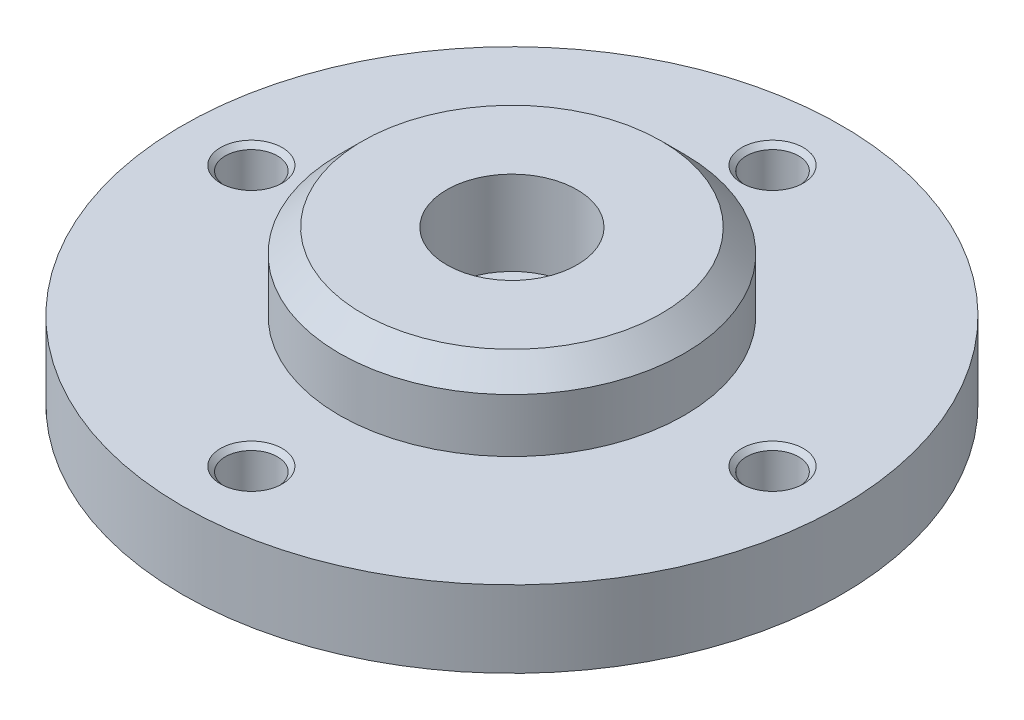
ISO-10303-21;
HEADER;
FILE_DESCRIPTION(('STEP AP214'),'2;1');
FILE_NAME('part.step','',(''),(''),'','','');
FILE_SCHEMA(('AUTOMOTIVE_DESIGN { 1 0 10303 214 1 1 1 1 }'));
ENDSEC;
DATA;
#1=APPLICATION_CONTEXT('core data for automotive mechanical design processes');
#2=APPLICATION_PROTOCOL_DEFINITION('international standard','automotive_design',2000,#1);
#3=PRODUCT_CONTEXT('',#1,'mechanical');
#4=PRODUCT('Part','Part','',(#3));
#5=PRODUCT_RELATED_PRODUCT_CATEGORY('part','',(#4));
#6=PRODUCT_DEFINITION_FORMATION('','',#4);
#7=PRODUCT_DEFINITION_CONTEXT('part definition',#1,'design');
#8=PRODUCT_DEFINITION('design','',#6,#7);
#9=PRODUCT_DEFINITION_SHAPE('','',#8);
#10=(LENGTH_UNIT() NAMED_UNIT(*) SI_UNIT(.MILLI.,.METRE.));
#11=(NAMED_UNIT(*) PLANE_ANGLE_UNIT() SI_UNIT($,.RADIAN.));
#12=(NAMED_UNIT(*) SI_UNIT($,.STERADIAN.) SOLID_ANGLE_UNIT());
#13=UNCERTAINTY_MEASURE_WITH_UNIT(LENGTH_MEASURE(1.E-05),#10,'distance_accuracy_value','');
#14=(GEOMETRIC_REPRESENTATION_CONTEXT(3) GLOBAL_UNCERTAINTY_ASSIGNED_CONTEXT((#13)) GLOBAL_UNIT_ASSIGNED_CONTEXT((#10,
#11,#12)) REPRESENTATION_CONTEXT('',''));
#15=CARTESIAN_POINT('',(0.,0.,0.));
#16=DIRECTION('',(0.,0.,1.));
#17=DIRECTION('',(1.,0.,0.));
#18=AXIS2_PLACEMENT_3D('',#15,#16,#17);
#19=CARTESIAN_POINT('',(43.,10.,0.));
#20=DIRECTION('',(0.,-1.,0.));
#21=DIRECTION('',(0.,0.,-1.));
#22=AXIS2_PLACEMENT_3D('',#19,#20,#21);
#23=PLANE('',#22);
#24=CARTESIAN_POINT('',(0.,10.,-34.));
#25=DIRECTION('',(0.,1.,0.));
#26=DIRECTION('',(0.,0.,1.));
#27=AXIS2_PLACEMENT_3D('',#24,#25,#26);
#28=CIRCLE('',#27,4.025);
#29=CARTESIAN_POINT('',(0.,10.,-29.975));
#30=VERTEX_POINT('',#29);
#31=EDGE_CURVE('E218',#30,#30,#28,.T.);
#32=ORIENTED_EDGE('',*,*,#31,.F.);
#33=EDGE_LOOP('',(#32));
#34=FACE_BOUND('',#33,.T.);
#35=CARTESIAN_POINT('',(34.,10.,0.));
#36=DIRECTION('',(0.,1.,0.));
#37=DIRECTION('',(0.,0.,1.));
#38=AXIS2_PLACEMENT_3D('',#35,#36,#37);
#39=CIRCLE('',#38,4.025);
#40=CARTESIAN_POINT('',(34.,10.,4.025));
#41=VERTEX_POINT('',#40);
#42=EDGE_CURVE('E72',#41,#41,#39,.T.);
#43=ORIENTED_EDGE('',*,*,#42,.F.);
#44=EDGE_LOOP('',(#43));
#45=FACE_BOUND('',#44,.T.);
#46=CARTESIAN_POINT('',(0.,10.,34.));
#47=DIRECTION('',(0.,1.,0.));
#48=DIRECTION('',(0.,0.,1.));
#49=AXIS2_PLACEMENT_3D('',#46,#47,#48);
#50=CIRCLE('',#49,4.025);
#51=CARTESIAN_POINT('',(0.,10.,38.025));
#52=VERTEX_POINT('',#51);
#53=EDGE_CURVE('E65',#52,#52,#50,.T.);
#54=ORIENTED_EDGE('',*,*,#53,.F.);
#55=EDGE_LOOP('',(#54));
#56=FACE_BOUND('',#55,.T.);
#57=CARTESIAN_POINT('',(0.,10.,0.));
#58=DIRECTION('',(0.,1.,0.));
#59=DIRECTION('',(0.,0.,1.));
#60=AXIS2_PLACEMENT_3D('',#57,#58,#59);
#61=CIRCLE('',#60,43.);
#62=CARTESIAN_POINT('',(0.,10.,43.));
#63=VERTEX_POINT('',#62);
#64=EDGE_CURVE('E106',#63,#63,#61,.T.);
#65=ORIENTED_EDGE('',*,*,#64,.T.);
#66=EDGE_LOOP('',(#65));
#67=FACE_BOUND('',#66,.T.);
#68=CARTESIAN_POINT('',(0.,10.,0.));
#69=DIRECTION('',(0.,1.,0.));
#70=DIRECTION('',(0.,0.,1.));
#71=AXIS2_PLACEMENT_3D('',#68,#69,#70);
#72=CIRCLE('',#71,22.5);
#73=CARTESIAN_POINT('',(0.,10.,22.5));
#74=VERTEX_POINT('',#73);
#75=EDGE_CURVE('E103',#74,#74,#72,.T.);
#76=ORIENTED_EDGE('',*,*,#75,.F.);
#77=EDGE_LOOP('',(#76));
#78=FACE_BOUND('',#77,.T.);
#79=CARTESIAN_POINT('',(-34.,10.,0.));
#80=DIRECTION('',(0.,1.,0.));
#81=DIRECTION('',(0.,0.,1.));
#82=AXIS2_PLACEMENT_3D('',#79,#80,#81);
#83=CIRCLE('',#82,4.025);
#84=CARTESIAN_POINT('',(-34.,10.,4.025));
#85=VERTEX_POINT('',#84);
#86=EDGE_CURVE('E61',#85,#85,#83,.T.);
#87=ORIENTED_EDGE('',*,*,#86,.F.);
#88=EDGE_LOOP('',(#87));
#89=FACE_BOUND('',#88,.T.);
#90=ADVANCED_FACE('F36',(#34,#45,#56,#67,#78,#89),#23,.F.);
#91=CARTESIAN_POINT('',(25.,0.,0.));
#92=DIRECTION('',(0.,1.,0.));
#93=DIRECTION('',(0.,0.,1.));
#94=AXIS2_PLACEMENT_3D('',#91,#92,#93);
#95=PLANE('',#94);
#96=CARTESIAN_POINT('',(0.,0.,-34.));
#97=DIRECTION('',(0.,1.,0.));
#98=DIRECTION('',(0.,0.,1.));
#99=AXIS2_PLACEMENT_3D('',#96,#97,#98);
#100=CIRCLE('',#99,3.39999999999999);
#101=CARTESIAN_POINT('',(0.,0.,-30.6));
#102=VERTEX_POINT('',#101);
#103=EDGE_CURVE('E41',#102,#102,#100,.T.);
#104=ORIENTED_EDGE('',*,*,#103,.T.);
#105=EDGE_LOOP('',(#104));
#106=FACE_BOUND('',#105,.T.);
#107=CARTESIAN_POINT('',(34.,0.,0.));
#108=DIRECTION('',(0.,1.,0.));
#109=DIRECTION('',(0.,0.,1.));
#110=AXIS2_PLACEMENT_3D('',#107,#108,#109);
#111=CIRCLE('',#110,3.39999999999999);
#112=CARTESIAN_POINT('',(34.,0.,3.39999999999999));
#113=VERTEX_POINT('',#112);
#114=EDGE_CURVE('E63',#113,#113,#111,.T.);
#115=ORIENTED_EDGE('',*,*,#114,.T.);
#116=EDGE_LOOP('',(#115));
#117=FACE_BOUND('',#116,.T.);
#118=CARTESIAN_POINT('',(0.,0.,34.));
#119=DIRECTION('',(0.,1.,0.));
#120=DIRECTION('',(0.,0.,1.));
#121=AXIS2_PLACEMENT_3D('',#118,#119,#120);
#122=CIRCLE('',#121,3.39999999999999);
#123=CARTESIAN_POINT('',(0.,0.,37.4));
#124=VERTEX_POINT('',#123);
#125=EDGE_CURVE('E59',#124,#124,#122,.T.);
#126=ORIENTED_EDGE('',*,*,#125,.T.);
#127=EDGE_LOOP('',(#126));
#128=FACE_BOUND('',#127,.T.);
#129=CARTESIAN_POINT('',(-34.,0.,0.));
#130=DIRECTION('',(0.,1.,0.));
#131=DIRECTION('',(0.,0.,1.));
#132=AXIS2_PLACEMENT_3D('',#129,#130,#131);
#133=CIRCLE('',#132,3.39999999999999);
#134=CARTESIAN_POINT('',(-34.,0.,3.4));
#135=VERTEX_POINT('',#134);
#136=EDGE_CURVE('E54',#135,#135,#133,.T.);
#137=ORIENTED_EDGE('',*,*,#136,.T.);
#138=EDGE_LOOP('',(#137));
#139=FACE_BOUND('',#138,.T.);
#140=CARTESIAN_POINT('',(0.,0.,0.));
#141=DIRECTION('',(0.,1.,0.));
#142=DIRECTION('',(0.,0.,1.));
#143=AXIS2_PLACEMENT_3D('',#140,#141,#142);
#144=CIRCLE('',#143,43.);
#145=CARTESIAN_POINT('',(0.,0.,43.));
#146=VERTEX_POINT('',#145);
#147=EDGE_CURVE('E50',#146,#146,#144,.T.);
#148=ORIENTED_EDGE('',*,*,#147,.F.);
#149=EDGE_LOOP('',(#148));
#150=FACE_BOUND('',#149,.T.);
#151=CARTESIAN_POINT('',(0.,0.,0.));
#152=DIRECTION('',(0.,1.,0.));
#153=DIRECTION('',(0.,0.,1.));
#154=AXIS2_PLACEMENT_3D('',#151,#152,#153);
#155=CIRCLE('',#154,25.);
#156=CARTESIAN_POINT('',(0.,0.,25.));
#157=VERTEX_POINT('',#156);
#158=EDGE_CURVE('E57',#157,#157,#155,.T.);
#159=ORIENTED_EDGE('',*,*,#158,.T.);
#160=EDGE_LOOP('',(#159));
#161=FACE_BOUND('',#160,.T.);
#162=ADVANCED_FACE('F113',(#106,#117,#128,#139,#150,#161),#95,.F.);
#163=CARTESIAN_POINT('',(0.,0.,0.));
#164=DIRECTION('',(0.,1.,0.));
#165=DIRECTION('',(0.,0.,1.));
#166=AXIS2_PLACEMENT_3D('',#163,#164,#165);
#167=CYLINDRICAL_SURFACE('',#166,43.);
#168=ORIENTED_EDGE('',*,*,#64,.F.);
#169=EDGE_LOOP('',(#168));
#170=FACE_BOUND('',#169,.T.);
#171=ORIENTED_EDGE('',*,*,#147,.T.);
#172=EDGE_LOOP('',(#171));
#173=FACE_BOUND('',#172,.T.);
#174=ADVANCED_FACE('F111',(#170,#173),#167,.T.);
#175=CARTESIAN_POINT('',(0.,0.,0.));
#176=DIRECTION('',(0.,1.,0.));
#177=DIRECTION('',(0.,0.,1.));
#178=AXIS2_PLACEMENT_3D('',#175,#176,#177);
#179=CYLINDRICAL_SURFACE('',#178,22.5);
#180=CARTESIAN_POINT('',(0.,17.,0.));
#181=DIRECTION('',(0.,-1.,0.));
#182=DIRECTION('',(0.,0.,-1.));
#183=AXIS2_PLACEMENT_3D('',#180,#181,#182);
#184=CIRCLE('',#183,22.5);
#185=CARTESIAN_POINT('',(0.,17.,-22.5));
#186=VERTEX_POINT('',#185);
#187=EDGE_CURVE('E10',#186,#186,#184,.T.);
#188=ORIENTED_EDGE('',*,*,#187,.T.);
#189=EDGE_LOOP('',(#188));
#190=FACE_BOUND('',#189,.T.);
#191=ORIENTED_EDGE('',*,*,#75,.T.);
#192=EDGE_LOOP('',(#191));
#193=FACE_BOUND('',#192,.T.);
#194=ADVANCED_FACE('F151',(#190,#193),#179,.T.);
#195=CARTESIAN_POINT('',(22.5,20.,0.));
#196=DIRECTION('',(0.,-1.,0.));
#197=DIRECTION('',(0.,0.,-1.));
#198=AXIS2_PLACEMENT_3D('',#195,#196,#197);
#199=PLANE('',#198);
#200=CARTESIAN_POINT('',(0.,20.,0.));
#201=DIRECTION('',(0.,-1.,0.));
#202=DIRECTION('',(0.,0.,-1.));
#203=AXIS2_PLACEMENT_3D('',#200,#201,#202);
#204=CIRCLE('',#203,19.5);
#205=CARTESIAN_POINT('',(0.,20.,-19.5));
#206=VERTEX_POINT('',#205);
#207=EDGE_CURVE('E45',#206,#206,#204,.F.);
#208=ORIENTED_EDGE('',*,*,#207,.T.);
#209=EDGE_LOOP('',(#208));
#210=FACE_BOUND('',#209,.T.);
#211=CARTESIAN_POINT('',(0.,20.,0.));
#212=DIRECTION('',(0.,1.,0.));
#213=DIRECTION('',(0.,0.,1.));
#214=AXIS2_PLACEMENT_3D('',#211,#212,#213);
#215=CIRCLE('',#214,8.5);
#216=CARTESIAN_POINT('',(0.,20.,8.5));
#217=VERTEX_POINT('',#216);
#218=EDGE_CURVE('E100',#217,#217,#215,.T.);
#219=ORIENTED_EDGE('',*,*,#218,.F.);
#220=EDGE_LOOP('',(#219));
#221=FACE_BOUND('',#220,.T.);
#222=ADVANCED_FACE('F146',(#210,#221),#199,.F.);
#223=CARTESIAN_POINT('',(0.,0.,0.));
#224=DIRECTION('',(0.,1.,0.));
#225=DIRECTION('',(0.,0.,1.));
#226=AXIS2_PLACEMENT_3D('',#223,#224,#225);
#227=CYLINDRICAL_SURFACE('',#226,8.5);
#228=CARTESIAN_POINT('',(0.,9.,0.));
#229=DIRECTION('',(0.,1.,0.));
#230=DIRECTION('',(0.,0.,1.));
#231=AXIS2_PLACEMENT_3D('',#228,#229,#230);
#232=CIRCLE('',#231,8.5);
#233=CARTESIAN_POINT('',(0.,9.,8.5));
#234=VERTEX_POINT('',#233);
#235=EDGE_CURVE('E97',#234,#234,#232,.T.);
#236=ORIENTED_EDGE('',*,*,#235,.F.);
#237=EDGE_LOOP('',(#236));
#238=FACE_BOUND('',#237,.T.);
#239=ORIENTED_EDGE('',*,*,#218,.T.);
#240=EDGE_LOOP('',(#239));
#241=FACE_BOUND('',#240,.T.);
#242=ADVANCED_FACE('F140',(#238,#241),#227,.F.);
#243=CARTESIAN_POINT('',(8.5,9.,0.));
#244=DIRECTION('',(0.,-1.,0.));
#245=DIRECTION('',(0.,0.,-1.));
#246=AXIS2_PLACEMENT_3D('',#243,#244,#245);
#247=PLANE('',#246);
#248=CARTESIAN_POINT('',(0.,9.,0.));
#249=DIRECTION('',(0.,1.,0.));
#250=DIRECTION('',(0.,0.,1.));
#251=AXIS2_PLACEMENT_3D('',#248,#249,#250);
#252=CIRCLE('',#251,5.);
#253=CARTESIAN_POINT('',(0.,9.,5.));
#254=VERTEX_POINT('',#253);
#255=EDGE_CURVE('E94',#254,#254,#252,.T.);
#256=ORIENTED_EDGE('',*,*,#255,.F.);
#257=EDGE_LOOP('',(#256));
#258=FACE_BOUND('',#257,.T.);
#259=ORIENTED_EDGE('',*,*,#235,.T.);
#260=EDGE_LOOP('',(#259));
#261=FACE_BOUND('',#260,.T.);
#262=ADVANCED_FACE('F134',(#258,#261),#247,.F.);
#263=CARTESIAN_POINT('',(0.,0.,0.));
#264=DIRECTION('',(0.,1.,0.));
#265=DIRECTION('',(0.,0.,1.));
#266=AXIS2_PLACEMENT_3D('',#263,#264,#265);
#267=CYLINDRICAL_SURFACE('',#266,5.);
#268=CARTESIAN_POINT('',(0.,3.,0.));
#269=DIRECTION('',(0.,1.,0.));
#270=DIRECTION('',(0.,0.,1.));
#271=AXIS2_PLACEMENT_3D('',#268,#269,#270);
#272=CIRCLE('',#271,5.);
#273=CARTESIAN_POINT('',(0.,3.,5.));
#274=VERTEX_POINT('',#273);
#275=EDGE_CURVE('E91',#274,#274,#272,.T.);
#276=ORIENTED_EDGE('',*,*,#275,.F.);
#277=EDGE_LOOP('',(#276));
#278=FACE_BOUND('',#277,.T.);
#279=ORIENTED_EDGE('',*,*,#255,.T.);
#280=EDGE_LOOP('',(#279));
#281=FACE_BOUND('',#280,.T.);
#282=ADVANCED_FACE('F128',(#278,#281),#267,.F.);
#283=CARTESIAN_POINT('',(5.,3.,0.));
#284=DIRECTION('',(0.,1.,0.));
#285=DIRECTION('',(0.,0.,1.));
#286=AXIS2_PLACEMENT_3D('',#283,#284,#285);
#287=PLANE('',#286);
#288=CARTESIAN_POINT('',(0.,3.,0.));
#289=DIRECTION('',(0.,1.,0.));
#290=DIRECTION('',(0.,0.,1.));
#291=AXIS2_PLACEMENT_3D('',#288,#289,#290);
#292=CIRCLE('',#291,25.);
#293=CARTESIAN_POINT('',(0.,3.,25.));
#294=VERTEX_POINT('',#293);
#295=EDGE_CURVE('E88',#294,#294,#292,.T.);
#296=ORIENTED_EDGE('',*,*,#295,.F.);
#297=EDGE_LOOP('',(#296));
#298=FACE_BOUND('',#297,.T.);
#299=ORIENTED_EDGE('',*,*,#275,.T.);
#300=EDGE_LOOP('',(#299));
#301=FACE_BOUND('',#300,.T.);
#302=ADVANCED_FACE('F122',(#298,#301),#287,.F.);
#303=CARTESIAN_POINT('',(0.,0.,0.));
#304=DIRECTION('',(0.,1.,0.));
#305=DIRECTION('',(0.,0.,1.));
#306=AXIS2_PLACEMENT_3D('',#303,#304,#305);
#307=CYLINDRICAL_SURFACE('',#306,25.);
#308=ORIENTED_EDGE('',*,*,#158,.F.);
#309=EDGE_LOOP('',(#308));
#310=FACE_BOUND('',#309,.T.);
#311=ORIENTED_EDGE('',*,*,#295,.T.);
#312=EDGE_LOOP('',(#311));
#313=FACE_BOUND('',#312,.T.);
#314=ADVANCED_FACE('F119',(#310,#313),#307,.F.);
#315=CARTESIAN_POINT('',(0.,20.,0.));
#316=DIRECTION('',(0.,-1.,0.));
#317=DIRECTION('',(0.,0.,-1.));
#318=AXIS2_PLACEMENT_3D('',#315,#316,#317);
#319=CONICAL_SURFACE('',#318,19.5,0.785398163397446);
#320=ORIENTED_EDGE('',*,*,#187,.F.);
#321=EDGE_LOOP('',(#320));
#322=FACE_BOUND('',#321,.T.);
#323=ORIENTED_EDGE('',*,*,#207,.F.);
#324=EDGE_LOOP('',(#323));
#325=FACE_BOUND('',#324,.T.);
#326=ADVANCED_FACE('F39',(#322,#325),#319,.T.);
#327=CARTESIAN_POINT('',(-34.,10.,0.));
#328=DIRECTION('',(0.,1.,0.));
#329=DIRECTION('',(0.,0.,1.));
#330=AXIS2_PLACEMENT_3D('',#327,#328,#329);
#331=CYLINDRICAL_SURFACE('',#330,3.39999999999999);
#332=CARTESIAN_POINT('',(-34.,9.37499999999999,0.));
#333=DIRECTION('',(0.,1.,0.));
#334=DIRECTION('',(0.,0.,1.));
#335=AXIS2_PLACEMENT_3D('',#332,#333,#334);
#336=CIRCLE('',#335,3.4);
#337=CARTESIAN_POINT('',(-34.,9.37499999999999,3.4));
#338=VERTEX_POINT('',#337);
#339=EDGE_CURVE('E58',#338,#338,#336,.T.);
#340=ORIENTED_EDGE('',*,*,#339,.T.);
#341=EDGE_LOOP('',(#340));
#342=FACE_BOUND('',#341,.T.);
#343=ORIENTED_EDGE('',*,*,#136,.F.);
#344=EDGE_LOOP('',(#343));
#345=FACE_BOUND('',#344,.T.);
#346=ADVANCED_FACE('F180',(#342,#345),#331,.F.);
#347=CARTESIAN_POINT('',(-34.,10.,0.));
#348=DIRECTION('',(0.,1.,0.));
#349=DIRECTION('',(0.,0.,1.));
#350=AXIS2_PLACEMENT_3D('',#347,#348,#349);
#351=CONICAL_SURFACE('',#350,4.025,0.785398163397447);
#352=ORIENTED_EDGE('',*,*,#339,.F.);
#353=EDGE_LOOP('',(#352));
#354=FACE_BOUND('',#353,.T.);
#355=ORIENTED_EDGE('',*,*,#86,.T.);
#356=EDGE_LOOP('',(#355));
#357=FACE_BOUND('',#356,.T.);
#358=ADVANCED_FACE('F177',(#354,#357),#351,.F.);
#359=CARTESIAN_POINT('',(0.,10.,34.));
#360=DIRECTION('',(0.,1.,0.));
#361=DIRECTION('',(0.,0.,1.));
#362=AXIS2_PLACEMENT_3D('',#359,#360,#361);
#363=CYLINDRICAL_SURFACE('',#362,3.39999999999999);
#364=CARTESIAN_POINT('',(0.,9.37499999999999,34.));
#365=DIRECTION('',(0.,1.,0.));
#366=DIRECTION('',(0.,0.,1.));
#367=AXIS2_PLACEMENT_3D('',#364,#365,#366);
#368=CIRCLE('',#367,3.4);
#369=CARTESIAN_POINT('',(0.,9.37499999999999,37.4));
#370=VERTEX_POINT('',#369);
#371=EDGE_CURVE('E62',#370,#370,#368,.T.);
#372=ORIENTED_EDGE('',*,*,#371,.T.);
#373=EDGE_LOOP('',(#372));
#374=FACE_BOUND('',#373,.T.);
#375=ORIENTED_EDGE('',*,*,#125,.F.);
#376=EDGE_LOOP('',(#375));
#377=FACE_BOUND('',#376,.T.);
#378=ADVANCED_FACE('F179',(#374,#377),#363,.F.);
#379=CARTESIAN_POINT('',(0.,10.,34.));
#380=DIRECTION('',(0.,1.,0.));
#381=DIRECTION('',(0.,0.,1.));
#382=AXIS2_PLACEMENT_3D('',#379,#380,#381);
#383=CONICAL_SURFACE('',#382,4.025,0.785398163397447);
#384=ORIENTED_EDGE('',*,*,#371,.F.);
#385=EDGE_LOOP('',(#384));
#386=FACE_BOUND('',#385,.T.);
#387=ORIENTED_EDGE('',*,*,#53,.T.);
#388=EDGE_LOOP('',(#387));
#389=FACE_BOUND('',#388,.T.);
#390=ADVANCED_FACE('F187',(#386,#389),#383,.F.);
#391=CARTESIAN_POINT('',(34.,10.,0.));
#392=DIRECTION('',(0.,1.,0.));
#393=DIRECTION('',(0.,0.,1.));
#394=AXIS2_PLACEMENT_3D('',#391,#392,#393);
#395=CYLINDRICAL_SURFACE('',#394,3.39999999999999);
#396=CARTESIAN_POINT('',(34.,9.37499999999999,0.));
#397=DIRECTION('',(0.,1.,0.));
#398=DIRECTION('',(0.,0.,1.));
#399=AXIS2_PLACEMENT_3D('',#396,#397,#398);
#400=CIRCLE('',#399,3.4);
#401=CARTESIAN_POINT('',(34.,9.37499999999999,3.4));
#402=VERTEX_POINT('',#401);
#403=EDGE_CURVE('E66',#402,#402,#400,.T.);
#404=ORIENTED_EDGE('',*,*,#403,.T.);
#405=EDGE_LOOP('',(#404));
#406=FACE_BOUND('',#405,.T.);
#407=ORIENTED_EDGE('',*,*,#114,.F.);
#408=EDGE_LOOP('',(#407));
#409=FACE_BOUND('',#408,.T.);
#410=ADVANCED_FACE('F196',(#406,#409),#395,.F.);
#411=CARTESIAN_POINT('',(34.,10.,0.));
#412=DIRECTION('',(0.,1.,0.));
#413=DIRECTION('',(0.,0.,1.));
#414=AXIS2_PLACEMENT_3D('',#411,#412,#413);
#415=CONICAL_SURFACE('',#414,4.025,0.785398163397444);
#416=ORIENTED_EDGE('',*,*,#403,.F.);
#417=EDGE_LOOP('',(#416));
#418=FACE_BOUND('',#417,.T.);
#419=ORIENTED_EDGE('',*,*,#42,.T.);
#420=EDGE_LOOP('',(#419));
#421=FACE_BOUND('',#420,.T.);
#422=ADVANCED_FACE('F200',(#418,#421),#415,.F.);
#423=CARTESIAN_POINT('',(0.,10.,-34.));
#424=DIRECTION('',(0.,1.,0.));
#425=DIRECTION('',(0.,0.,1.));
#426=AXIS2_PLACEMENT_3D('',#423,#424,#425);
#427=CYLINDRICAL_SURFACE('',#426,3.39999999999999);
#428=CARTESIAN_POINT('',(0.,9.37499999999999,-34.));
#429=DIRECTION('',(0.,1.,0.));
#430=DIRECTION('',(0.,0.,1.));
#431=AXIS2_PLACEMENT_3D('',#428,#429,#430);
#432=CIRCLE('',#431,3.4);
#433=CARTESIAN_POINT('',(0.,9.37499999999999,-30.6));
#434=VERTEX_POINT('',#433);
#435=EDGE_CURVE('E216',#434,#434,#432,.T.);
#436=ORIENTED_EDGE('',*,*,#435,.T.);
#437=EDGE_LOOP('',(#436));
#438=FACE_BOUND('',#437,.T.);
#439=ORIENTED_EDGE('',*,*,#103,.F.);
#440=EDGE_LOOP('',(#439));
#441=FACE_BOUND('',#440,.T.);
#442=ADVANCED_FACE('F203',(#438,#441),#427,.F.);
#443=CARTESIAN_POINT('',(0.,10.,-34.));
#444=DIRECTION('',(0.,1.,0.));
#445=DIRECTION('',(0.,0.,1.));
#446=AXIS2_PLACEMENT_3D('',#443,#444,#445);
#447=CONICAL_SURFACE('',#446,4.025,0.785398163397447);
#448=ORIENTED_EDGE('',*,*,#435,.F.);
#449=EDGE_LOOP('',(#448));
#450=FACE_BOUND('',#449,.T.);
#451=ORIENTED_EDGE('',*,*,#31,.T.);
#452=EDGE_LOOP('',(#451));
#453=FACE_BOUND('',#452,.T.);
#454=ADVANCED_FACE('F207',(#450,#453),#447,.F.);
#455=CLOSED_SHELL('',(#90,#162,#174,#194,#222,#242,#262,#282,#302,#314,#326,#346,#358,#378,#390,
#410,#422,#442,#454));
#456=MANIFOLD_SOLID_BREP('B2',#455);
#457=ADVANCED_BREP_SHAPE_REPRESENTATION('',(#18,#456),#14);
#458=SHAPE_DEFINITION_REPRESENTATION(#9,#457);
ENDSEC;
END-ISO-10303-21;
